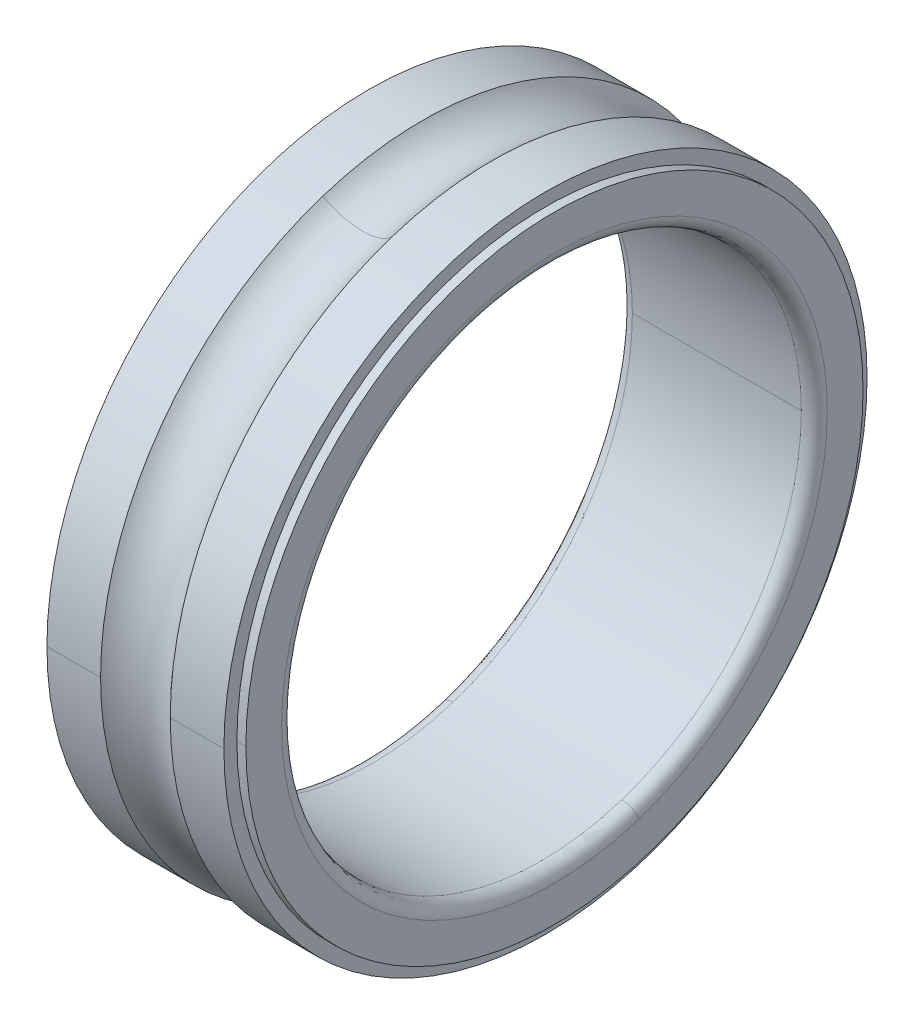
ISO-10303-21;
HEADER;
FILE_DESCRIPTION(('STEP AP214'),'2;1');
FILE_NAME('part.step','',(''),(''),'','','');
FILE_SCHEMA(('AUTOMOTIVE_DESIGN { 1 0 10303 214 1 1 1 1 }'));
ENDSEC;
DATA;
#1=APPLICATION_CONTEXT('core data for automotive mechanical design processes');
#2=APPLICATION_PROTOCOL_DEFINITION('international standard','automotive_design',2000,#1);
#3=PRODUCT_CONTEXT('',#1,'mechanical');
#4=PRODUCT('Part','Part','',(#3));
#5=PRODUCT_RELATED_PRODUCT_CATEGORY('part','',(#4));
#6=PRODUCT_DEFINITION_FORMATION('','',#4);
#7=PRODUCT_DEFINITION_CONTEXT('part definition',#1,'design');
#8=PRODUCT_DEFINITION('design','',#6,#7);
#9=PRODUCT_DEFINITION_SHAPE('','',#8);
#10=(LENGTH_UNIT() NAMED_UNIT(*) SI_UNIT(.MILLI.,.METRE.));
#11=(NAMED_UNIT(*) PLANE_ANGLE_UNIT() SI_UNIT($,.RADIAN.));
#12=(NAMED_UNIT(*) SI_UNIT($,.STERADIAN.) SOLID_ANGLE_UNIT());
#13=UNCERTAINTY_MEASURE_WITH_UNIT(LENGTH_MEASURE(1.E-05),#10,'distance_accuracy_value','');
#14=(GEOMETRIC_REPRESENTATION_CONTEXT(3) GLOBAL_UNCERTAINTY_ASSIGNED_CONTEXT((#13)) GLOBAL_UNIT_ASSIGNED_CONTEXT((#10,
#11,#12)) REPRESENTATION_CONTEXT('',''));
#15=CARTESIAN_POINT('',(0.,0.,0.));
#16=DIRECTION('',(0.,0.,1.));
#17=DIRECTION('',(1.,0.,0.));
#18=AXIS2_PLACEMENT_3D('',#15,#16,#17);
#19=CARTESIAN_POINT('',(0.,23.75,0.));
#20=DIRECTION('',(-1.,0.,0.));
#21=DIRECTION('',(0.,0.,1.));
#22=AXIS2_PLACEMENT_3D('',#19,#20,#21);
#23=PLANE('',#22);
#24=CARTESIAN_POINT('',(0.,0.,0.));
#25=DIRECTION('',(1.,0.,0.));
#26=DIRECTION('',(0.,0.,-1.));
#27=AXIS2_PLACEMENT_3D('',#24,#25,#26);
#28=CIRCLE('',#27,21.);
#29=CARTESIAN_POINT('',(0.,19.9721868421975,6.48935688187365));
#30=VERTEX_POINT('',#29);
#31=CARTESIAN_POINT('',(0.,-19.9721868421975,-6.48935688187364));
#32=VERTEX_POINT('',#31);
#33=EDGE_CURVE('E13',#30,#32,#28,.T.);
#34=ORIENTED_EDGE('',*,*,#33,.T.);
#35=CARTESIAN_POINT('',(0.,-19.9721868421982,-6.48935688187389));
#36=CARTESIAN_POINT('',(0.,-18.9527996449717,-9.6265513007404));
#37=CARTESIAN_POINT('',(0.,-17.3176794735263,-12.5637797669449));
#38=CARTESIAN_POINT('',(0.,-15.118107867562,-15.1390084363418));
#39=CARTESIAN_POINT('',(0.,-9.82778905209665,-19.2881146807117));
#40=CARTESIAN_POINT('',(0.,-3.36151600636661,-21.1293102340576));
#41=CARTESIAN_POINT('',(0.,0.0147797410590782,-21.3950362295894));
#42=CARTESIAN_POINT('',(0.,6.68945904005496,-20.5880379601854));
#43=CARTESIAN_POINT('',(0.,12.5637297063266,-17.3176352188327));
#44=CARTESIAN_POINT('',(0.,15.1390205227054,-15.1181215248857));
#45=CARTESIAN_POINT('',(0.,19.2881177141266,-9.82778309868488));
#46=CARTESIAN_POINT('',(0.,21.1292920808643,-3.36151425586648));
#47=CARTESIAN_POINT('',(0.,21.3951014572819,0.0147652534244056));
#48=CARTESIAN_POINT('',(0.,20.9914818887777,3.35213252144713));
#49=CARTESIAN_POINT('',(0.,19.9721868421982,6.48935688187389));
#50=B_SPLINE_CURVE_WITH_KNOTS('',5,(#35,#36,#37,#38,#39,#40,#41,#42,#43,#44,#45,#46,#47,#48,
#49),.UNSPECIFIED.,.F.,.F.,(6,3,3,3,6),(0.,0.785398163397448,1.5707963267949,2.35619449019234,
3.14159265358979),.UNSPECIFIED.);
#51=EDGE_CURVE('E33',#32,#30,#50,.T.);
#52=ORIENTED_EDGE('',*,*,#51,.T.);
#53=EDGE_LOOP('',(#34,#52));
#54=FACE_BOUND('',#53,.T.);
#55=CARTESIAN_POINT('',(0.,0.,0.));
#56=DIRECTION('',(1.,0.,0.));
#57=DIRECTION('',(0.,0.,-1.));
#58=AXIS2_PLACEMENT_3D('',#55,#56,#57);
#59=CIRCLE('',#58,23.75);
#60=CARTESIAN_POINT('',(0.,0.,23.75));
#61=VERTEX_POINT('',#60);
#62=CARTESIAN_POINT('',(0.,0.,-23.75));
#63=VERTEX_POINT('',#62);
#64=EDGE_CURVE('E407',#61,#63,#59,.T.);
#65=ORIENTED_EDGE('',*,*,#64,.F.);
#66=CARTESIAN_POINT('',(0.,0.,0.));
#67=DIRECTION('',(1.,0.,0.));
#68=DIRECTION('',(0.,0.,-1.));
#69=AXIS2_PLACEMENT_3D('',#66,#67,#68);
#70=CIRCLE('',#69,23.75);
#71=EDGE_CURVE('E402',#63,#61,#70,.T.);
#72=ORIENTED_EDGE('',*,*,#71,.F.);
#73=EDGE_LOOP('',(#65,#72));
#74=FACE_BOUND('',#73,.T.);
#75=ADVANCED_FACE('F24',(#54,#74),#23,.T.);
#76=CARTESIAN_POINT('',(15.,0.,0.));
#77=DIRECTION('',(1.,0.,0.));
#78=DIRECTION('',(0.,-1.,0.));
#79=AXIS2_PLACEMENT_3D('',#76,#77,#78);
#80=CYLINDRICAL_SURFACE('',#79,23.75);
#81=DIRECTION('',(1.,0.,0.));
#82=VECTOR('',#81,1.);
#83=CARTESIAN_POINT('',(0.,0.,23.75));
#84=LINE('',#83,#82);
#85=CARTESIAN_POINT('',(0.69,0.,23.75));
#86=VERTEX_POINT('',#85);
#87=EDGE_CURVE('E398',#61,#86,#84,.T.);
#88=ORIENTED_EDGE('',*,*,#87,.T.);
#89=CARTESIAN_POINT('',(0.69,0.,0.));
#90=DIRECTION('',(1.,0.,0.));
#91=DIRECTION('',(0.,0.,-1.));
#92=AXIS2_PLACEMENT_3D('',#89,#90,#91);
#93=CIRCLE('',#92,23.75);
#94=CARTESIAN_POINT('',(0.69,0.,-23.75));
#95=VERTEX_POINT('',#94);
#96=EDGE_CURVE('E393',#95,#86,#93,.T.);
#97=ORIENTED_EDGE('',*,*,#96,.F.);
#98=DIRECTION('',(1.,0.,0.));
#99=VECTOR('',#98,1.);
#100=CARTESIAN_POINT('',(0.,0.,-23.75));
#101=LINE('',#100,#99);
#102=EDGE_CURVE('E388',#63,#95,#101,.T.);
#103=ORIENTED_EDGE('',*,*,#102,.F.);
#104=ORIENTED_EDGE('',*,*,#71,.T.);
#105=EDGE_LOOP('',(#88,#97,#103,#104));
#106=FACE_BOUND('',#105,.T.);
#107=ADVANCED_FACE('F428',(#106),#80,.T.);
#108=CARTESIAN_POINT('',(15.,0.,0.));
#109=DIRECTION('',(1.,0.,0.));
#110=DIRECTION('',(0.,1.,0.));
#111=AXIS2_PLACEMENT_3D('',#108,#109,#110);
#112=CYLINDRICAL_SURFACE('',#111,23.75);
#113=ORIENTED_EDGE('',*,*,#87,.F.);
#114=ORIENTED_EDGE('',*,*,#64,.T.);
#115=ORIENTED_EDGE('',*,*,#102,.T.);
#116=CARTESIAN_POINT('',(0.69,0.,0.));
#117=DIRECTION('',(1.,0.,0.));
#118=DIRECTION('',(0.,0.,-1.));
#119=AXIS2_PLACEMENT_3D('',#116,#117,#118);
#120=CIRCLE('',#119,23.75);
#121=EDGE_CURVE('E383',#86,#95,#120,.T.);
#122=ORIENTED_EDGE('',*,*,#121,.F.);
#123=EDGE_LOOP('',(#113,#114,#115,#122));
#124=FACE_BOUND('',#123,.T.);
#125=ADVANCED_FACE('F423',(#124),#112,.T.);
#126=CARTESIAN_POINT('',(0.69,24.75,0.));
#127=DIRECTION('',(-1.,0.,0.));
#128=DIRECTION('',(0.,0.,1.));
#129=AXIS2_PLACEMENT_3D('',#126,#127,#128);
#130=PLANE('',#129);
#131=ORIENTED_EDGE('',*,*,#96,.T.);
#132=ORIENTED_EDGE('',*,*,#121,.T.);
#133=EDGE_LOOP('',(#131,#132));
#134=FACE_BOUND('',#133,.T.);
#135=CARTESIAN_POINT('',(0.69,0.,0.));
#136=DIRECTION('',(1.,0.,0.));
#137=DIRECTION('',(0.,0.,-1.));
#138=AXIS2_PLACEMENT_3D('',#135,#136,#137);
#139=CIRCLE('',#138,24.75);
#140=CARTESIAN_POINT('',(0.69,0.,24.75));
#141=VERTEX_POINT('',#140);
#142=CARTESIAN_POINT('',(0.69,0.,-24.75));
#143=VERTEX_POINT('',#142);
#144=EDGE_CURVE('E378',#141,#143,#139,.T.);
#145=ORIENTED_EDGE('',*,*,#144,.F.);
#146=CARTESIAN_POINT('',(0.69,0.,0.));
#147=DIRECTION('',(1.,0.,0.));
#148=DIRECTION('',(0.,0.,-1.));
#149=AXIS2_PLACEMENT_3D('',#146,#147,#148);
#150=CIRCLE('',#149,24.75);
#151=EDGE_CURVE('E373',#143,#141,#150,.T.);
#152=ORIENTED_EDGE('',*,*,#151,.F.);
#153=EDGE_LOOP('',(#145,#152));
#154=FACE_BOUND('',#153,.T.);
#155=ADVANCED_FACE('F430',(#134,#154),#130,.T.);
#156=CARTESIAN_POINT('',(15.,0.,0.));
#157=DIRECTION('',(1.,0.,0.));
#158=DIRECTION('',(0.,-1.,0.));
#159=AXIS2_PLACEMENT_3D('',#156,#157,#158);
#160=CYLINDRICAL_SURFACE('',#159,24.75);
#161=DIRECTION('',(1.,0.,0.));
#162=VECTOR('',#161,1.);
#163=CARTESIAN_POINT('',(0.69,0.,24.75));
#164=LINE('',#163,#162);
#165=CARTESIAN_POINT('',(4.8190486763091,0.,24.75));
#166=VERTEX_POINT('',#165);
#167=EDGE_CURVE('E369',#141,#166,#164,.T.);
#168=ORIENTED_EDGE('',*,*,#167,.T.);
#169=CARTESIAN_POINT('',(4.8190486763091,0.,0.));
#170=DIRECTION('',(1.,0.,0.));
#171=DIRECTION('',(0.,0.,-1.));
#172=AXIS2_PLACEMENT_3D('',#169,#170,#171);
#173=CIRCLE('',#172,24.75);
#174=CARTESIAN_POINT('',(4.81904867630903,23.538648778305,7.64817061077993));
#175=VERTEX_POINT('',#174);
#176=EDGE_CURVE('E364',#175,#166,#173,.T.);
#177=ORIENTED_EDGE('',*,*,#176,.F.);
#178=CARTESIAN_POINT('',(4.8190486763091,0.,0.));
#179=DIRECTION('',(1.,0.,0.));
#180=DIRECTION('',(0.,0.,-1.));
#181=AXIS2_PLACEMENT_3D('',#178,#179,#180);
#182=CIRCLE('',#181,24.75);
#183=CARTESIAN_POINT('',(4.8190486763091,0.,-24.75));
#184=VERTEX_POINT('',#183);
#185=EDGE_CURVE('E359',#184,#175,#182,.T.);
#186=ORIENTED_EDGE('',*,*,#185,.F.);
#187=DIRECTION('',(1.,0.,0.));
#188=VECTOR('',#187,1.);
#189=CARTESIAN_POINT('',(0.69,0.,-24.75));
#190=LINE('',#189,#188);
#191=EDGE_CURVE('E354',#143,#184,#190,.T.);
#192=ORIENTED_EDGE('',*,*,#191,.F.);
#193=ORIENTED_EDGE('',*,*,#151,.T.);
#194=EDGE_LOOP('',(#168,#177,#186,#192,#193));
#195=FACE_BOUND('',#194,.T.);
#196=ADVANCED_FACE('F433',(#195),#160,.T.);
#197=CARTESIAN_POINT('',(15.,0.,0.));
#198=DIRECTION('',(1.,0.,0.));
#199=DIRECTION('',(0.,1.,0.));
#200=AXIS2_PLACEMENT_3D('',#197,#198,#199);
#201=CYLINDRICAL_SURFACE('',#200,24.75);
#202=ORIENTED_EDGE('',*,*,#167,.F.);
#203=ORIENTED_EDGE('',*,*,#144,.T.);
#204=ORIENTED_EDGE('',*,*,#191,.T.);
#205=CARTESIAN_POINT('',(4.8190486763091,0.,0.));
#206=DIRECTION('',(1.,0.,0.));
#207=DIRECTION('',(0.,0.,-1.));
#208=AXIS2_PLACEMENT_3D('',#205,#206,#207);
#209=CIRCLE('',#208,24.75);
#210=CARTESIAN_POINT('',(4.81904867630903,-23.538648778305,-7.64817061077992));
#211=VERTEX_POINT('',#210);
#212=EDGE_CURVE('E349',#211,#184,#209,.T.);
#213=ORIENTED_EDGE('',*,*,#212,.F.);
#214=CARTESIAN_POINT('',(4.8190486763091,0.,0.));
#215=DIRECTION('',(1.,0.,0.));
#216=DIRECTION('',(0.,0.,-1.));
#217=AXIS2_PLACEMENT_3D('',#214,#215,#216);
#218=CIRCLE('',#217,24.75);
#219=EDGE_CURVE('E344',#166,#211,#218,.T.);
#220=ORIENTED_EDGE('',*,*,#219,.F.);
#221=EDGE_LOOP('',(#202,#203,#204,#213,#220));
#222=FACE_BOUND('',#221,.T.);
#223=ADVANCED_FACE('F439',(#222),#201,.T.);
#224=CARTESIAN_POINT('',(7.5,0.,0.));
#225=DIRECTION('',(1.,0.,0.));
#226=DIRECTION('',(0.,0.309016994374947,-0.951056516295154));
#227=AXIS2_PLACEMENT_3D('',#224,#225,#226);
#228=TOROIDAL_SURFACE('',#227,27.,3.5000000000001);
#229=CARTESIAN_POINT('',(7.5,-25.6785259399691,-8.34345884812357));
#230=DIRECTION('',(0.,0.309016994374947,-0.951056516295154));
#231=DIRECTION('',(-0.765986092483113,0.611393474761172,0.198653782098181));
#232=AXIS2_PLACEMENT_3D('',#229,#230,#231);
#233=CIRCLE('',#232,3.5000000000001);
#234=CARTESIAN_POINT('',(10.180951323691,-23.538648778305,-7.64817061077994));
#235=VERTEX_POINT('',#234);
#236=EDGE_CURVE('E340',#211,#235,#233,.T.);
#237=ORIENTED_EDGE('',*,*,#236,.T.);
#238=CARTESIAN_POINT('',(10.180951323691,0.,0.));
#239=DIRECTION('',(1.,0.,0.));
#240=DIRECTION('',(0.,0.,-1.));
#241=AXIS2_PLACEMENT_3D('',#238,#239,#240);
#242=CIRCLE('',#241,24.75);
#243=CARTESIAN_POINT('',(10.180951323691,0.,24.75));
#244=VERTEX_POINT('',#243);
#245=EDGE_CURVE('E335',#244,#235,#242,.T.);
#246=ORIENTED_EDGE('',*,*,#245,.F.);
#247=CARTESIAN_POINT('',(10.180951323691,0.,0.));
#248=DIRECTION('',(1.,0.,0.));
#249=DIRECTION('',(0.,0.,-1.));
#250=AXIS2_PLACEMENT_3D('',#247,#248,#249);
#251=CIRCLE('',#250,24.75);
#252=CARTESIAN_POINT('',(10.180951323691,23.538648778305,7.64817061077994));
#253=VERTEX_POINT('',#252);
#254=EDGE_CURVE('E330',#253,#244,#251,.T.);
#255=ORIENTED_EDGE('',*,*,#254,.F.);
#256=CARTESIAN_POINT('',(7.5,25.6785259399691,8.34345884812358));
#257=DIRECTION('',(0.,-0.309016994374947,0.951056516295154));
#258=DIRECTION('',(-0.765986092483114,-0.611393474761171,-0.198653782098181));
#259=AXIS2_PLACEMENT_3D('',#256,#257,#258);
#260=CIRCLE('',#259,3.5000000000001);
#261=EDGE_CURVE('E325',#175,#253,#260,.T.);
#262=ORIENTED_EDGE('',*,*,#261,.F.);
#263=ORIENTED_EDGE('',*,*,#176,.T.);
#264=ORIENTED_EDGE('',*,*,#219,.T.);
#265=EDGE_LOOP('',(#237,#246,#255,#262,#263,#264));
#266=FACE_BOUND('',#265,.T.);
#267=ADVANCED_FACE('F446',(#266),#228,.F.);
#268=CARTESIAN_POINT('',(7.5,0.,0.));
#269=DIRECTION('',(1.,0.,0.));
#270=DIRECTION('',(0.,-0.309016994374947,0.951056516295154));
#271=AXIS2_PLACEMENT_3D('',#268,#269,#270);
#272=TOROIDAL_SURFACE('',#271,27.,3.5000000000001);
#273=ORIENTED_EDGE('',*,*,#236,.F.);
#274=ORIENTED_EDGE('',*,*,#212,.T.);
#275=ORIENTED_EDGE('',*,*,#185,.T.);
#276=ORIENTED_EDGE('',*,*,#261,.T.);
#277=CARTESIAN_POINT('',(10.180951323691,0.,0.));
#278=DIRECTION('',(1.,0.,0.));
#279=DIRECTION('',(0.,0.,-1.));
#280=AXIS2_PLACEMENT_3D('',#277,#278,#279);
#281=CIRCLE('',#280,24.75);
#282=CARTESIAN_POINT('',(10.180951323691,0.,-24.75));
#283=VERTEX_POINT('',#282);
#284=EDGE_CURVE('E320',#283,#253,#281,.T.);
#285=ORIENTED_EDGE('',*,*,#284,.F.);
#286=CARTESIAN_POINT('',(10.180951323691,0.,0.));
#287=DIRECTION('',(1.,0.,0.));
#288=DIRECTION('',(0.,0.,-1.));
#289=AXIS2_PLACEMENT_3D('',#286,#287,#288);
#290=CIRCLE('',#289,24.75);
#291=EDGE_CURVE('E315',#235,#283,#290,.T.);
#292=ORIENTED_EDGE('',*,*,#291,.F.);
#293=EDGE_LOOP('',(#273,#274,#275,#276,#285,#292));
#294=FACE_BOUND('',#293,.T.);
#295=ADVANCED_FACE('F443',(#294),#272,.F.);
#296=CARTESIAN_POINT('',(15.,0.,0.));
#297=DIRECTION('',(1.,0.,0.));
#298=DIRECTION('',(0.,1.,0.));
#299=AXIS2_PLACEMENT_3D('',#296,#297,#298);
#300=CYLINDRICAL_SURFACE('',#299,24.75);
#301=DIRECTION('',(1.,0.,0.));
#302=VECTOR('',#301,1.);
#303=CARTESIAN_POINT('',(10.180951323691,0.,24.75));
#304=LINE('',#303,#302);
#305=CARTESIAN_POINT('',(14.31,0.,24.75));
#306=VERTEX_POINT('',#305);
#307=EDGE_CURVE('E310',#244,#306,#304,.T.);
#308=ORIENTED_EDGE('',*,*,#307,.F.);
#309=ORIENTED_EDGE('',*,*,#245,.T.);
#310=ORIENTED_EDGE('',*,*,#291,.T.);
#311=DIRECTION('',(1.,0.,0.));
#312=VECTOR('',#311,1.);
#313=CARTESIAN_POINT('',(10.180951323691,0.,-24.75));
#314=LINE('',#313,#312);
#315=CARTESIAN_POINT('',(14.31,0.,-24.75));
#316=VERTEX_POINT('',#315);
#317=EDGE_CURVE('E306',#283,#316,#314,.T.);
#318=ORIENTED_EDGE('',*,*,#317,.T.);
#319=CARTESIAN_POINT('',(14.31,0.,0.));
#320=DIRECTION('',(1.,0.,0.));
#321=DIRECTION('',(0.,0.,-1.));
#322=AXIS2_PLACEMENT_3D('',#319,#320,#321);
#323=CIRCLE('',#322,24.75);
#324=EDGE_CURVE('E301',#306,#316,#323,.T.);
#325=ORIENTED_EDGE('',*,*,#324,.F.);
#326=EDGE_LOOP('',(#308,#309,#310,#318,#325));
#327=FACE_BOUND('',#326,.T.);
#328=ADVANCED_FACE('F452',(#327),#300,.T.);
#329=CARTESIAN_POINT('',(14.31,23.75,0.));
#330=DIRECTION('',(1.,0.,0.));
#331=DIRECTION('',(0.,0.,-1.));
#332=AXIS2_PLACEMENT_3D('',#329,#330,#331);
#333=PLANE('',#332);
#334=CARTESIAN_POINT('',(14.31,0.,0.));
#335=DIRECTION('',(1.,0.,0.));
#336=DIRECTION('',(0.,0.,-1.));
#337=AXIS2_PLACEMENT_3D('',#334,#335,#336);
#338=CIRCLE('',#337,24.75);
#339=EDGE_CURVE('E296',#316,#306,#338,.T.);
#340=ORIENTED_EDGE('',*,*,#339,.T.);
#341=ORIENTED_EDGE('',*,*,#324,.T.);
#342=EDGE_LOOP('',(#340,#341));
#343=FACE_BOUND('',#342,.T.);
#344=CARTESIAN_POINT('',(14.31,0.,0.));
#345=DIRECTION('',(1.,0.,0.));
#346=DIRECTION('',(0.,0.,-1.));
#347=AXIS2_PLACEMENT_3D('',#344,#345,#346);
#348=CIRCLE('',#347,23.75);
#349=CARTESIAN_POINT('',(14.31,0.,23.75));
#350=VERTEX_POINT('',#349);
#351=CARTESIAN_POINT('',(14.31,0.,-23.75));
#352=VERTEX_POINT('',#351);
#353=EDGE_CURVE('E291',#350,#352,#348,.T.);
#354=ORIENTED_EDGE('',*,*,#353,.F.);
#355=CARTESIAN_POINT('',(14.31,0.,0.));
#356=DIRECTION('',(1.,0.,0.));
#357=DIRECTION('',(0.,0.,-1.));
#358=AXIS2_PLACEMENT_3D('',#355,#356,#357);
#359=CIRCLE('',#358,23.75);
#360=EDGE_CURVE('E286',#352,#350,#359,.T.);
#361=ORIENTED_EDGE('',*,*,#360,.F.);
#362=EDGE_LOOP('',(#354,#361));
#363=FACE_BOUND('',#362,.T.);
#364=ADVANCED_FACE('F456',(#343,#363),#333,.T.);
#365=CARTESIAN_POINT('',(15.,0.,0.));
#366=DIRECTION('',(1.,0.,0.));
#367=DIRECTION('',(0.,-1.,0.));
#368=AXIS2_PLACEMENT_3D('',#365,#366,#367);
#369=CYLINDRICAL_SURFACE('',#368,23.75);
#370=DIRECTION('',(1.,0.,0.));
#371=VECTOR('',#370,1.);
#372=CARTESIAN_POINT('',(14.31,0.,23.75));
#373=LINE('',#372,#371);
#374=CARTESIAN_POINT('',(15.,0.,23.75));
#375=VERTEX_POINT('',#374);
#376=EDGE_CURVE('E282',#350,#375,#373,.T.);
#377=ORIENTED_EDGE('',*,*,#376,.T.);
#378=CARTESIAN_POINT('',(15.,0.,0.));
#379=DIRECTION('',(1.,0.,0.));
#380=DIRECTION('',(0.,0.,-1.));
#381=AXIS2_PLACEMENT_3D('',#378,#379,#380);
#382=CIRCLE('',#381,23.75);
#383=CARTESIAN_POINT('',(15.,0.,-23.75));
#384=VERTEX_POINT('',#383);
#385=EDGE_CURVE('E277',#384,#375,#382,.T.);
#386=ORIENTED_EDGE('',*,*,#385,.F.);
#387=DIRECTION('',(1.,0.,0.));
#388=VECTOR('',#387,1.);
#389=CARTESIAN_POINT('',(14.31,0.,-23.75));
#390=LINE('',#389,#388);
#391=EDGE_CURVE('E272',#352,#384,#390,.T.);
#392=ORIENTED_EDGE('',*,*,#391,.F.);
#393=ORIENTED_EDGE('',*,*,#360,.T.);
#394=EDGE_LOOP('',(#377,#386,#392,#393));
#395=FACE_BOUND('',#394,.T.);
#396=ADVANCED_FACE('F459',(#395),#369,.T.);
#397=CARTESIAN_POINT('',(15.,0.,0.));
#398=DIRECTION('',(1.,0.,0.));
#399=DIRECTION('',(0.,1.,0.));
#400=AXIS2_PLACEMENT_3D('',#397,#398,#399);
#401=CYLINDRICAL_SURFACE('',#400,23.75);
#402=ORIENTED_EDGE('',*,*,#376,.F.);
#403=ORIENTED_EDGE('',*,*,#353,.T.);
#404=ORIENTED_EDGE('',*,*,#391,.T.);
#405=CARTESIAN_POINT('',(15.,0.,0.));
#406=DIRECTION('',(1.,0.,0.));
#407=DIRECTION('',(0.,0.,-1.));
#408=AXIS2_PLACEMENT_3D('',#405,#406,#407);
#409=CIRCLE('',#408,23.75);
#410=EDGE_CURVE('E269',#375,#384,#409,.T.);
#411=ORIENTED_EDGE('',*,*,#410,.F.);
#412=EDGE_LOOP('',(#402,#403,#404,#411));
#413=FACE_BOUND('',#412,.T.);
#414=ADVANCED_FACE('F465',(#413),#401,.T.);
#415=CARTESIAN_POINT('',(15.,21.,0.));
#416=DIRECTION('',(1.,0.,0.));
#417=DIRECTION('',(0.,0.,-1.));
#418=AXIS2_PLACEMENT_3D('',#415,#416,#417);
#419=PLANE('',#418);
#420=ORIENTED_EDGE('',*,*,#385,.T.);
#421=ORIENTED_EDGE('',*,*,#410,.T.);
#422=EDGE_LOOP('',(#420,#421));
#423=FACE_BOUND('',#422,.T.);
#424=CARTESIAN_POINT('',(15.,-19.9721868421967,-6.48935688187345));
#425=CARTESIAN_POINT('',(15.,-19.8660118134118,-6.81615360728426));
#426=CARTESIAN_POINT('',(15.,-19.7518026238298,-7.14033922348104));
#427=CARTESIAN_POINT('',(15.,-19.5076210129556,-7.7827186302954));
#428=CARTESIAN_POINT('',(15.,-19.3776485916635,-8.10091242091297));
#429=CARTESIAN_POINT('',(15.,-19.1022456072533,-8.73053856941777));
#430=CARTESIAN_POINT('',(15.,-18.9568150441353,-9.04197092730499));
#431=CARTESIAN_POINT('',(15.,-18.6508482813472,-9.65732475988335));
#432=CARTESIAN_POINT('',(15.,-18.4903120816771,-9.9612462345745));
#433=CARTESIAN_POINT('',(15.,-18.1545202153776,-10.5608459082961));
#434=CARTESIAN_POINT('',(15.,-17.9792645487483,-10.8565241073266));
#435=CARTESIAN_POINT('',(15.,-17.6144561091669,-11.4389249737312));
#436=CARTESIAN_POINT('',(15.,-17.424903336215,-11.7256476411052));
#437=CARTESIAN_POINT('',(15.,-17.031957291854,-12.2894466884528));
#438=CARTESIAN_POINT('',(15.,-16.828564020445,-12.5665230684264));
#439=CARTESIAN_POINT('',(15.,-16.4084269824602,-13.110362043918));
#440=CARTESIAN_POINT('',(15.,-16.1916832158845,-13.3771246394361));
#441=CARTESIAN_POINT('',(15.,-15.7453673393144,-13.8996933904296));
#442=CARTESIAN_POINT('',(15.,-15.5157952293201,-14.155499545905));
#443=CARTESIAN_POINT('',(15.,-15.0443757260298,-14.655539157681));
#444=CARTESIAN_POINT('',(15.,-14.8025283327338,-14.8997726139817));
#445=CARTESIAN_POINT('',(15.,-14.3071408941807,-15.3760784475387));
#446=CARTESIAN_POINT('',(15.,-14.0536008489237,-15.608150824795));
#447=CARTESIAN_POINT('',(15.,-13.535438906682,-16.0595754176012));
#448=CARTESIAN_POINT('',(15.,-13.2708170096975,-16.278927633151));
#449=CARTESIAN_POINT('',(15.,-12.7311288613136,-16.7043834638379));
#450=CARTESIAN_POINT('',(15.,-12.4560626099143,-16.9104870789751));
#451=CARTESIAN_POINT('',(15.,-11.8961484113975,-17.308949187177));
#452=CARTESIAN_POINT('',(15.,-11.61130046428,-17.5013076802417));
#453=CARTESIAN_POINT('',(15.,-11.0325090979803,-17.8718161358398));
#454=CARTESIAN_POINT('',(15.,-10.738565678798,-18.0499660983732));
#455=CARTESIAN_POINT('',(15.,-10.142291503812,-18.391628314045));
#456=CARTESIAN_POINT('',(15.,-9.83996074800828,-18.5551405671834));
#457=CARTESIAN_POINT('',(15.,-9.22764024105125,-18.8671334487253));
#458=CARTESIAN_POINT('',(15.,-8.91765048989791,-19.0156140771289));
#459=CARTESIAN_POINT('',(15.,-8.290758784704,-19.297186006362));
#460=CARTESIAN_POINT('',(15.,-7.97385683066344,-19.4302773071915));
#461=CARTESIAN_POINT('',(15.,-7.3339041642597,-19.6807499526754));
#462=CARTESIAN_POINT('',(15.,-7.01085345189653,-19.7981312973298));
#463=CARTESIAN_POINT('',(15.,-6.35938152630957,-20.0169012485227));
#464=CARTESIAN_POINT('',(15.,-6.03096031308577,-20.1182898550613));
#465=CARTESIAN_POINT('',(15.,-5.36953858124651,-20.3048300759889));
#466=CARTESIAN_POINT('',(15.,-5.03653806263105,-20.3899816903779));
#467=CARTESIAN_POINT('',(15.,-4.3667599474252,-20.5438427893089));
#468=CARTESIAN_POINT('',(15.,-4.02998235083482,-20.612552273851));
#469=CARTESIAN_POINT('',(15.,-3.35346140640755,-20.7333635859214));
#470=CARTESIAN_POINT('',(15.,-3.01371805857066,-20.7854654134499));
#471=CARTESIAN_POINT('',(15.,-2.33208408313332,-20.8729358936273));
#472=CARTESIAN_POINT('',(15.,-1.99019345553287,-20.9083045462762));
#473=CARTESIAN_POINT('',(15.,-1.30508856503638,-20.9622234705121));
#474=CARTESIAN_POINT('',(15.,-0.961874302140345,-20.9807737420992));
#475=CARTESIAN_POINT('',(15.,-0.274948974274021,-21.0010112149826));
#476=CARTESIAN_POINT('',(15.,0.0687620906962641,-21.0026984162788));
#477=CARTESIAN_POINT('',(15.,0.755852992650046,-20.9892056839648));
#478=CARTESIAN_POINT('',(15.,1.09923282963354,-20.9740257503545));
#479=CARTESIAN_POINT('',(15.,1.78483404350992,-20.9268353180171));
#480=CARTESIAN_POINT('',(15.,2.12705542040281,-20.8948248192899));
#481=CARTESIAN_POINT('',(15.,2.80951527282598,-20.8140503728139));
#482=CARTESIAN_POINT('',(15.,3.14975374835627,-20.7652864250651));
#483=CARTESIAN_POINT('',(15.,3.82742813376533,-20.6511225571672));
#484=CARTESIAN_POINT('',(15.,4.1648640436441,-20.5857226370181));
#485=CARTESIAN_POINT('',(15.,4.83612038508733,-20.4384443784555));
#486=CARTESIAN_POINT('',(15.,5.16994081665179,-20.3565660400421));
#487=CARTESIAN_POINT('',(15.,5.83316199880753,-20.1765281970399));
#488=CARTESIAN_POINT('',(15.,6.16256274939882,-20.0783686924511));
#489=CARTESIAN_POINT('',(15.,6.81615101434796,-19.8660049919424));
#490=CARTESIAN_POINT('',(15.,7.14033852870581,-19.7518007960226));
#491=CARTESIAN_POINT('',(15.,7.78271932507051,-19.5076228407628));
#492=CARTESIAN_POINT('',(15.,8.10091260707737,-19.377649081423));
#493=CARTESIAN_POINT('',(15.,8.73053838325327,-19.1022451174939));
#494=CARTESIAN_POINT('',(15.,9.04197087742232,-18.9568149129047));
#495=CARTESIAN_POINT('',(15.,9.65732480976592,-18.6508484125779));
#496=CARTESIAN_POINT('',(15.,9.96124624794046,-18.4903121168403));
#497=CARTESIAN_POINT('',(15.,10.5608458949301,-18.1545201802145));
#498=CARTESIAN_POINT('',(15.,10.8565241037452,-17.9792645393264));
#499=CARTESIAN_POINT('',(15.,11.4389249773125,-17.6144561185889));
#500=CARTESIAN_POINT('',(15.,11.7256476420648,-17.4249033387396));
#501=CARTESIAN_POINT('',(15.,12.2894466874931,-17.0319572893294));
#502=CARTESIAN_POINT('',(15.,12.5665230681692,-16.8285640197686));
#503=CARTESIAN_POINT('',(15.,13.1103620441751,-16.4084269831367));
#504=CARTESIAN_POINT('',(15.,13.377124639505,-16.1916832160658));
#505=CARTESIAN_POINT('',(15.,13.8996933903607,-15.7453673391332));
#506=CARTESIAN_POINT('',(15.,14.1554995458865,-15.5157952292716));
#507=CARTESIAN_POINT('',(15.,14.6555391576994,-15.0443757260784));
#508=CARTESIAN_POINT('',(15.,14.8997726139866,-14.8025283327469));
#509=CARTESIAN_POINT('',(15.,15.3760784475337,-14.3071408941678));
#510=CARTESIAN_POINT('',(15.,15.6081508247937,-14.0536008489202));
#511=CARTESIAN_POINT('',(15.,16.0595754176025,-13.5354389066856));
#512=CARTESIAN_POINT('',(15.,16.2789276331513,-13.2708170096985));
#513=CARTESIAN_POINT('',(15.,16.7043834638375,-12.7311288613127));
#514=CARTESIAN_POINT('',(15.,16.9104870789749,-12.4560626099141));
#515=CARTESIAN_POINT('',(15.,17.308949187177,-11.8961484113978));
#516=CARTESIAN_POINT('',(15.,17.5013076802417,-11.6113004642802));
#517=CARTESIAN_POINT('',(15.,17.8718161358397,-11.0325090979803));
#518=CARTESIAN_POINT('',(15.,18.0499660983731,-10.738565678798));
#519=CARTESIAN_POINT('',(15.,18.391628314045,-10.142291503812));
#520=CARTESIAN_POINT('',(15.,18.5551405671834,-9.83996074800835));
#521=CARTESIAN_POINT('',(15.,18.8671334487253,-9.22764024105131));
#522=CARTESIAN_POINT('',(15.,19.0156140771288,-8.91765048989797));
#523=CARTESIAN_POINT('',(15.,19.297186006362,-8.29075878470405));
#524=CARTESIAN_POINT('',(15.,19.4302773071915,-7.97385683066348));
#525=CARTESIAN_POINT('',(15.,19.6807499526753,-7.33390416425978));
#526=CARTESIAN_POINT('',(15.,19.7981312973295,-7.01085345189665));
#527=CARTESIAN_POINT('',(15.,20.016901248523,-6.35938152630955));
#528=CARTESIAN_POINT('',(15.,20.1182898550623,-6.03096031308556));
#529=CARTESIAN_POINT('',(15.,20.3048300759879,-5.36953858124683));
#530=CARTESIAN_POINT('',(15.,20.3899816903743,-5.03653806263208));
#531=CARTESIAN_POINT('',(15.,20.5438427893125,-4.36675994742428));
#532=CARTESIAN_POINT('',(15.,20.6125522738644,-4.02998235083122));
#533=CARTESIAN_POINT('',(15.,20.733363585908,-3.35346140641125));
#534=CARTESIAN_POINT('',(15.,20.7854654133998,-3.01371805858433));
#535=CARTESIAN_POINT('',(15.,20.8729358936774,-2.33208408311977));
#536=CARTESIAN_POINT('',(15.,20.9083045464633,-1.99019345548213));
#537=CARTESIAN_POINT('',(15.,20.962223470325,-1.30508856508725));
#538=CARTESIAN_POINT('',(15.,20.9807737414008,-0.961874302330007));
#539=CARTESIAN_POINT('',(15.,21.001011215681,-0.274948974084504));
#540=CARTESIAN_POINT('',(15.,21.0026984188853,0.0687620914037546));
#541=CARTESIAN_POINT('',(15.,20.9892056813583,0.755852991942415));
#542=CARTESIAN_POINT('',(15.,20.9740257406269,1.09923282699282));
#543=CARTESIAN_POINT('',(15.,20.9268353277447,1.78483404615051));
#544=CARTESIAN_POINT('',(15.,20.8948248555938,2.1270554302578));
#545=CARTESIAN_POINT('',(15.,20.81405033651,2.80951526297088));
#546=CARTESIAN_POINT('',(15.,20.765286289577,3.14975371157666));
#547=CARTESIAN_POINT('',(15.,20.6511226926553,3.82742817054484));
#548=CARTESIAN_POINT('',(15.,20.5857231426665,4.16486418090724));
#549=CARTESIAN_POINT('',(15.,20.4384438728071,4.83612024782408));
#550=CARTESIAN_POINT('',(15.,20.3565641529364,5.16994030437853));
#551=CARTESIAN_POINT('',(15.,20.1765300841456,5.83316251108068));
#552=CARTESIAN_POINT('',(15.,20.0783757352255,6.16256466122839));
#553=CARTESIAN_POINT('',(15.,19.9721868421968,6.48935688187334));
#554=B_SPLINE_CURVE_WITH_KNOTS('',3,(#424,#425,#426,#427,#428,#429,#430,#431,#432,#433,#434,
#435,#436,#437,#438,#439,#440,#441,#442,#443,#444,#445,#446,#447,#448,#449,#450,#451,#452,#453,
#454,#455,#456,#457,#458,#459,#460,#461,#462,#463,#464,#465,#466,#467,#468,#469,#470,#471,#472,
#473,#474,#475,#476,#477,#478,#479,#480,#481,#482,#483,#484,#485,#486,#487,#488,#489,#490,#491,
#492,#493,#494,#495,#496,#497,#498,#499,#500,#501,#502,#503,#504,#505,#506,#507,#508,#509,#510,
#511,#512,#513,#514,#515,#516,#517,#518,#519,#520,#521,#522,#523,#524,#525,#526,#527,#528,#529,
#530,#531,#532,#533,#534,#535,#536,#537,#538,#539,#540,#541,#542,#543,#544,#545,#546,#547,#548,
#549,#550,#551,#552,#553),.UNSPECIFIED.,.F.,.F.,(4,2,2,2,2,2,2,2,2,2,2,2,2,2,2,2,2,2,2,2,2,2,2,
2,2,2,2,2,2,2,2,2,2,2,2,2,2,2,2,2,2,2,2,2,2,2,2,2,2,2,2,2,2,2,2,2,2,2,2,2,2,2,2,2,4),(0.,
1.03073159796224,2.06146319592448,3.09219479388672,4.12292639184895,5.15365798981119,
6.18438958777343,7.21512118573566,8.24585278369791,9.27658438166014,10.3073159796224,
11.3380475775846,12.3687791755469,13.3995107735091,14.4302423714713,15.4609739694336,
16.4917055673958,17.5224371653581,18.5531687633203,19.5839003612825,20.6146319592448,
21.645363557207,22.6760951551692,23.7068267531315,24.7375583510937,25.768289949056,
26.7990215470182,27.8297531449804,28.8604847429427,29.8912163409049,30.9219479388671,
31.9526795368294,32.9834111347916,34.0141427327539,35.0448743307161,36.0756059286783,
37.1063375266406,38.1370691246028,39.1678007225651,40.1985323205273,41.2292639184895,
42.2599955164518,43.290727114414,44.3214587123762,45.3521903103385,46.3829219083007,
47.4136535062629,48.4443851042252,49.4751167021874,50.5058483001497,51.5365798981119,
52.5673114960741,53.5980430940364,54.6287746919986,55.6595062899608,56.6902378879231,
57.7209694858853,58.7517010838475,59.7824326818098,60.813164279772,61.8438958777343,
62.8746274756965,63.9053590736588,64.936090671621,65.9668222695832),.UNSPECIFIED.);
#555=CARTESIAN_POINT('',(15.,-19.9721868421968,-6.48935688187341));
#556=VERTEX_POINT('',#555);
#557=CARTESIAN_POINT('',(15.,19.9721868421968,6.48935688187342));
#558=VERTEX_POINT('',#557);
#559=EDGE_CURVE('E268',#556,#558,#554,.T.);
#560=ORIENTED_EDGE('',*,*,#559,.F.);
#561=CARTESIAN_POINT('',(15.,19.9721868421967,6.48935688187345));
#562=CARTESIAN_POINT('',(15.,19.8660118134118,6.81615360728426));
#563=CARTESIAN_POINT('',(15.,19.7518026238298,7.14033922348104));
#564=CARTESIAN_POINT('',(15.,19.5076210129556,7.7827186302954));
#565=CARTESIAN_POINT('',(15.,19.3776485916635,8.10091242091297));
#566=CARTESIAN_POINT('',(15.,19.1022456072533,8.73053856941777));
#567=CARTESIAN_POINT('',(15.,18.9568150441353,9.04197092730499));
#568=CARTESIAN_POINT('',(15.,18.6508482813472,9.65732475988336));
#569=CARTESIAN_POINT('',(15.,18.4903120816771,9.9612462345745));
#570=CARTESIAN_POINT('',(15.,18.1545202153776,10.5608459082961));
#571=CARTESIAN_POINT('',(15.,17.9792645487483,10.8565241073266));
#572=CARTESIAN_POINT('',(15.,17.6144561091669,11.4389249737312));
#573=CARTESIAN_POINT('',(15.,17.424903336215,11.7256476411052));
#574=CARTESIAN_POINT('',(15.,17.031957291854,12.2894466884528));
#575=CARTESIAN_POINT('',(15.,16.828564020445,12.5665230684264));
#576=CARTESIAN_POINT('',(15.,16.4084269824602,13.1103620439181));
#577=CARTESIAN_POINT('',(15.,16.1916832158845,13.3771246394361));
#578=CARTESIAN_POINT('',(15.,15.7453673393144,13.8996933904296));
#579=CARTESIAN_POINT('',(15.,15.5157952293201,14.155499545905));
#580=CARTESIAN_POINT('',(15.,15.0443757260298,14.655539157681));
#581=CARTESIAN_POINT('',(15.,14.8025283327338,14.8997726139817));
#582=CARTESIAN_POINT('',(15.,14.3071408941807,15.3760784475387));
#583=CARTESIAN_POINT('',(15.,14.0536008489236,15.608150824795));
#584=CARTESIAN_POINT('',(15.,13.535438906682,16.0595754176012));
#585=CARTESIAN_POINT('',(15.,13.2708170096975,16.278927633151));
#586=CARTESIAN_POINT('',(15.,12.7311288613136,16.7043834638379));
#587=CARTESIAN_POINT('',(15.,12.4560626099143,16.9104870789751));
#588=CARTESIAN_POINT('',(15.,11.8961484113975,17.308949187177));
#589=CARTESIAN_POINT('',(15.,11.61130046428,17.5013076802417));
#590=CARTESIAN_POINT('',(15.,11.0325090979803,17.8718161358398));
#591=CARTESIAN_POINT('',(15.,10.738565678798,18.0499660983732));
#592=CARTESIAN_POINT('',(15.,10.142291503812,18.391628314045));
#593=CARTESIAN_POINT('',(15.,9.83996074800827,18.5551405671834));
#594=CARTESIAN_POINT('',(15.,9.22764024105125,18.8671334487253));
#595=CARTESIAN_POINT('',(15.,8.9176504898979,19.0156140771289));
#596=CARTESIAN_POINT('',(15.,8.29075878470399,19.297186006362));
#597=CARTESIAN_POINT('',(15.,7.97385683066342,19.4302773071915));
#598=CARTESIAN_POINT('',(15.,7.33390416425969,19.6807499526754));
#599=CARTESIAN_POINT('',(15.,7.01085345189651,19.7981312973298));
#600=CARTESIAN_POINT('',(15.,6.35938152630955,20.0169012485227));
#601=CARTESIAN_POINT('',(15.,6.03096031308575,20.1182898550613));
#602=CARTESIAN_POINT('',(15.,5.36953858124649,20.3048300759889));
#603=CARTESIAN_POINT('',(15.,5.03653806263103,20.3899816903779));
#604=CARTESIAN_POINT('',(15.,4.36675994742517,20.543842789309));
#605=CARTESIAN_POINT('',(15.,4.02998235083478,20.612552273851));
#606=CARTESIAN_POINT('',(15.,3.35346140640751,20.7333635859215));
#607=CARTESIAN_POINT('',(15.,3.01371805857062,20.7854654134499));
#608=CARTESIAN_POINT('',(15.,2.33208408313329,20.8729358936273));
#609=CARTESIAN_POINT('',(15.,1.99019345553284,20.9083045462762));
#610=CARTESIAN_POINT('',(15.,1.30508856503636,20.9622234705121));
#611=CARTESIAN_POINT('',(15.,0.961874302140322,20.9807737420992));
#612=CARTESIAN_POINT('',(15.,0.274948974273998,21.0010112149826));
#613=CARTESIAN_POINT('',(15.,-0.0687620906962899,21.0026984162788));
#614=CARTESIAN_POINT('',(15.,-0.755852992650073,20.9892056839648));
#615=CARTESIAN_POINT('',(15.,-1.09923282963357,20.9740257503545));
#616=CARTESIAN_POINT('',(15.,-1.78483404350995,20.9268353180171));
#617=CARTESIAN_POINT('',(15.,-2.12705542040283,20.8948248192899));
#618=CARTESIAN_POINT('',(15.,-2.80951527282601,20.8140503728139));
#619=CARTESIAN_POINT('',(15.,-3.1497537483563,20.7652864250651));
#620=CARTESIAN_POINT('',(15.,-3.82742813376536,20.6511225571672));
#621=CARTESIAN_POINT('',(15.,-4.16486404364413,20.5857226370181));
#622=CARTESIAN_POINT('',(15.,-4.83612038508736,20.4384443784555));
#623=CARTESIAN_POINT('',(15.,-5.16994081665182,20.3565660400421));
#624=CARTESIAN_POINT('',(15.,-5.83316199880757,20.1765281970399));
#625=CARTESIAN_POINT('',(15.,-6.16256274939886,20.0783686924511));
#626=CARTESIAN_POINT('',(15.,-6.816151014348,19.8660049919424));
#627=CARTESIAN_POINT('',(15.,-7.14033852870585,19.7518007960226));
#628=CARTESIAN_POINT('',(15.,-7.78271932507055,19.5076228407628));
#629=CARTESIAN_POINT('',(15.,-8.1009126070774,19.377649081423));
#630=CARTESIAN_POINT('',(15.,-8.7305383832533,19.1022451174939));
#631=CARTESIAN_POINT('',(15.,-9.04197087742235,18.9568149129047));
#632=CARTESIAN_POINT('',(15.,-9.65732480976594,18.6508484125778));
#633=CARTESIAN_POINT('',(15.,-9.96124624794048,18.4903121168403));
#634=CARTESIAN_POINT('',(15.,-10.5608458949301,18.1545201802145));
#635=CARTESIAN_POINT('',(15.,-10.8565241037452,17.9792645393263));
#636=CARTESIAN_POINT('',(15.,-11.4389249773125,17.6144561185889));
#637=CARTESIAN_POINT('',(15.,-11.7256476420648,17.4249033387396));
#638=CARTESIAN_POINT('',(15.,-12.2894466874931,17.0319572893294));
#639=CARTESIAN_POINT('',(15.,-12.5665230681692,16.8285640197686));
#640=CARTESIAN_POINT('',(15.,-13.1103620441752,16.4084269831367));
#641=CARTESIAN_POINT('',(15.,-13.377124639505,16.1916832160658));
#642=CARTESIAN_POINT('',(15.,-13.8996933903607,15.7453673391332));
#643=CARTESIAN_POINT('',(15.,-14.1554995458865,15.5157952292715));
#644=CARTESIAN_POINT('',(15.,-14.6555391576995,15.0443757260784));
#645=CARTESIAN_POINT('',(15.,-14.8997726139866,14.8025283327468));
#646=CARTESIAN_POINT('',(15.,-15.3760784475337,14.3071408941677));
#647=CARTESIAN_POINT('',(15.,-15.6081508247937,14.0536008489202));
#648=CARTESIAN_POINT('',(15.,-16.0595754176025,13.5354389066855));
#649=CARTESIAN_POINT('',(15.,-16.2789276331513,13.2708170096984));
#650=CARTESIAN_POINT('',(15.,-16.7043834638375,12.7311288613127));
#651=CARTESIAN_POINT('',(15.,-16.910487078975,12.456062609914));
#652=CARTESIAN_POINT('',(15.,-17.308949187177,11.8961484113978));
#653=CARTESIAN_POINT('',(15.,-17.5013076802417,11.6113004642801));
#654=CARTESIAN_POINT('',(15.,-17.8718161358397,11.0325090979802));
#655=CARTESIAN_POINT('',(15.,-18.0499660983732,10.738565678798));
#656=CARTESIAN_POINT('',(15.,-18.391628314045,10.142291503812));
#657=CARTESIAN_POINT('',(15.,-18.5551405671834,9.83996074800829));
#658=CARTESIAN_POINT('',(15.,-18.8671334487253,9.22764024105126));
#659=CARTESIAN_POINT('',(15.,-19.0156140771288,8.91765048989793));
#660=CARTESIAN_POINT('',(15.,-19.297186006362,8.29075878470402));
#661=CARTESIAN_POINT('',(15.,-19.4302773071915,7.97385683066344));
#662=CARTESIAN_POINT('',(15.,-19.6807499526753,7.33390416425974));
#663=CARTESIAN_POINT('',(15.,-19.7981312973295,7.01085345189662));
#664=CARTESIAN_POINT('',(15.,-20.016901248523,6.35938152630951));
#665=CARTESIAN_POINT('',(15.,-20.1182898550623,6.03096031308551));
#666=CARTESIAN_POINT('',(15.,-20.3048300759879,5.36953858124677));
#667=CARTESIAN_POINT('',(15.,-20.3899816903743,5.03653806263202));
#668=CARTESIAN_POINT('',(15.,-20.5438427893125,4.36675994742422));
#669=CARTESIAN_POINT('',(15.,-20.6125522738644,4.02998235083117));
#670=CARTESIAN_POINT('',(15.,-20.733363585908,3.35346140641119));
#671=CARTESIAN_POINT('',(15.,-20.7854654133998,3.01371805858427));
#672=CARTESIAN_POINT('',(15.,-20.8729358936774,2.33208408311971));
#673=CARTESIAN_POINT('',(15.,-20.9083045464633,1.99019345548208));
#674=CARTESIAN_POINT('',(15.,-20.962223470325,1.3050885650872));
#675=CARTESIAN_POINT('',(15.,-20.9807737414008,0.96187430232995));
#676=CARTESIAN_POINT('',(15.,-21.001011215681,0.274948974084445));
#677=CARTESIAN_POINT('',(15.,-21.0026984188853,-0.0687620914038131));
#678=CARTESIAN_POINT('',(15.,-20.9892056813583,-0.755852991942473));
#679=CARTESIAN_POINT('',(15.,-20.9740257406269,-1.09923282699287));
#680=CARTESIAN_POINT('',(15.,-20.9268353277447,-1.78483404615057));
#681=CARTESIAN_POINT('',(15.,-20.8948248555938,-2.12705543025786));
#682=CARTESIAN_POINT('',(15.,-20.81405033651,-2.80951526297093));
#683=CARTESIAN_POINT('',(15.,-20.765286289577,-3.14975371157671));
#684=CARTESIAN_POINT('',(15.,-20.6511226926553,-3.8274281705449));
#685=CARTESIAN_POINT('',(15.,-20.5857231426665,-4.1648641809073));
#686=CARTESIAN_POINT('',(15.,-20.4384438728071,-4.83612024782414));
#687=CARTESIAN_POINT('',(15.,-20.3565641529364,-5.16994030437858));
#688=CARTESIAN_POINT('',(15.,-20.1765300841456,-5.83316251108074));
#689=CARTESIAN_POINT('',(15.,-20.0783757352254,-6.16256466122845));
#690=CARTESIAN_POINT('',(15.,-19.9721868421968,-6.4893568818734));
#691=B_SPLINE_CURVE_WITH_KNOTS('',3,(#561,#562,#563,#564,#565,#566,#567,#568,#569,#570,#571,
#572,#573,#574,#575,#576,#577,#578,#579,#580,#581,#582,#583,#584,#585,#586,#587,#588,#589,#590,
#591,#592,#593,#594,#595,#596,#597,#598,#599,#600,#601,#602,#603,#604,#605,#606,#607,#608,#609,
#610,#611,#612,#613,#614,#615,#616,#617,#618,#619,#620,#621,#622,#623,#624,#625,#626,#627,#628,
#629,#630,#631,#632,#633,#634,#635,#636,#637,#638,#639,#640,#641,#642,#643,#644,#645,#646,#647,
#648,#649,#650,#651,#652,#653,#654,#655,#656,#657,#658,#659,#660,#661,#662,#663,#664,#665,#666,
#667,#668,#669,#670,#671,#672,#673,#674,#675,#676,#677,#678,#679,#680,#681,#682,#683,#684,#685,
#686,#687,#688,#689,#690),.UNSPECIFIED.,.F.,.F.,(4,2,2,2,2,2,2,2,2,2,2,2,2,2,2,2,2,2,2,2,2,2,2,
2,2,2,2,2,2,2,2,2,2,2,2,2,2,2,2,2,2,2,2,2,2,2,2,2,2,2,2,2,2,2,2,2,2,2,2,2,2,2,2,2,4),(0.,
1.03073159796224,2.06146319592448,3.09219479388672,4.12292639184896,5.15365798981119,
6.18438958777344,7.21512118573567,8.24585278369791,9.27658438166015,10.3073159796224,
11.3380475775846,12.3687791755469,13.3995107735091,14.4302423714713,15.4609739694336,
16.4917055673958,17.5224371653581,18.5531687633203,19.5839003612825,20.6146319592448,
21.645363557207,22.6760951551693,23.7068267531315,24.7375583510937,25.768289949056,
26.7990215470182,27.8297531449805,28.8604847429427,29.8912163409049,30.9219479388672,
31.9526795368294,32.9834111347917,34.0141427327539,35.0448743307161,36.0756059286784,
37.1063375266406,38.1370691246028,39.1678007225651,40.1985323205273,41.2292639184896,
42.2599955164518,43.290727114414,44.3214587123763,45.3521903103385,46.3829219083008,
47.413653506263,48.4443851042253,49.4751167021875,50.5058483001497,51.536579898112,
52.5673114960742,53.5980430940365,54.6287746919987,55.6595062899609,56.6902378879232,
57.7209694858854,58.7517010838476,59.7824326818099,60.8131642797721,61.8438958777344,
62.8746274756966,63.9053590736588,64.9360906716211,65.9668222695833),.UNSPECIFIED.);
#692=EDGE_CURVE('E231',#558,#556,#691,.T.);
#693=ORIENTED_EDGE('',*,*,#692,.F.);
#694=EDGE_LOOP('',(#560,#693));
#695=FACE_BOUND('',#694,.T.);
#696=ADVANCED_FACE('F216',(#423,#695),#419,.T.);
#697=CARTESIAN_POINT('',(14.0000000000015,0.,0.));
#698=DIRECTION('',(1.,0.,0.));
#699=DIRECTION('',(0.,0.309016994374947,-0.951056516295154));
#700=AXIS2_PLACEMENT_3D('',#697,#698,#699);
#701=TOROIDAL_SURFACE('',#700,20.9999999999985,0.99999999999845);
#702=CARTESIAN_POINT('',(14.0000000000015,-19.9721868421968,-6.48935688187341));
#703=DIRECTION('',(0.,0.309016994374947,-0.951056516295154));
#704=DIRECTION('',(-1.538325022923E-12,0.951056516295154,0.309016994374947));
#705=AXIS2_PLACEMENT_3D('',#702,#703,#704);
#706=CIRCLE('',#705,0.99999999999845);
#707=CARTESIAN_POINT('',(14.,-19.0211303259031,-6.18033988749894));
#708=VERTEX_POINT('',#707);
#709=EDGE_CURVE('E242',#708,#556,#706,.T.);
#710=ORIENTED_EDGE('',*,*,#709,.F.);
#711=CARTESIAN_POINT('',(14.,0.,0.));
#712=DIRECTION('',(1.,0.,0.));
#713=DIRECTION('',(0.,0.,-1.));
#714=AXIS2_PLACEMENT_3D('',#711,#712,#713);
#715=CIRCLE('',#714,20.);
#716=CARTESIAN_POINT('',(14.,0.,20.));
#717=VERTEX_POINT('',#716);
#718=EDGE_CURVE('E237',#717,#708,#715,.T.);
#719=ORIENTED_EDGE('',*,*,#718,.F.);
#720=CARTESIAN_POINT('',(14.,0.,0.));
#721=DIRECTION('',(1.,0.,0.));
#722=DIRECTION('',(0.,0.,-1.));
#723=AXIS2_PLACEMENT_3D('',#720,#721,#722);
#724=CIRCLE('',#723,20.);
#725=CARTESIAN_POINT('',(14.,19.0211303259031,6.18033988749895));
#726=VERTEX_POINT('',#725);
#727=EDGE_CURVE('E233',#726,#717,#724,.T.);
#728=ORIENTED_EDGE('',*,*,#727,.F.);
#729=CARTESIAN_POINT('',(14.0000000000015,19.9721868421968,6.48935688187342));
#730=DIRECTION('',(0.,-0.309016994374947,0.951056516295154));
#731=DIRECTION('',(-1.538325022923E-12,-0.951056516295154,-0.309016994374947));
#732=AXIS2_PLACEMENT_3D('',#729,#730,#731);
#733=CIRCLE('',#732,0.99999999999845);
#734=EDGE_CURVE('E190',#726,#558,#733,.T.);
#735=ORIENTED_EDGE('',*,*,#734,.T.);
#736=ORIENTED_EDGE('',*,*,#692,.T.);
#737=EDGE_LOOP('',(#710,#719,#728,#735,#736));
#738=FACE_BOUND('',#737,.T.);
#739=ADVANCED_FACE('F210',(#738),#701,.T.);
#740=CARTESIAN_POINT('',(14.0000000000015,0.,0.));
#741=DIRECTION('',(1.,0.,0.));
#742=DIRECTION('',(0.,-0.309016994374947,0.951056516295154));
#743=AXIS2_PLACEMENT_3D('',#740,#741,#742);
#744=TOROIDAL_SURFACE('',#743,20.9999999999985,0.99999999999845);
#745=ORIENTED_EDGE('',*,*,#709,.T.);
#746=ORIENTED_EDGE('',*,*,#559,.T.);
#747=ORIENTED_EDGE('',*,*,#734,.F.);
#748=CARTESIAN_POINT('',(14.,0.,0.));
#749=DIRECTION('',(1.,0.,0.));
#750=DIRECTION('',(0.,0.,-1.));
#751=AXIS2_PLACEMENT_3D('',#748,#749,#750);
#752=CIRCLE('',#751,20.);
#753=CARTESIAN_POINT('',(14.,0.,-20.));
#754=VERTEX_POINT('',#753);
#755=EDGE_CURVE('E185',#754,#726,#752,.T.);
#756=ORIENTED_EDGE('',*,*,#755,.F.);
#757=CARTESIAN_POINT('',(14.,0.,0.));
#758=DIRECTION('',(1.,0.,0.));
#759=DIRECTION('',(0.,0.,-1.));
#760=AXIS2_PLACEMENT_3D('',#757,#758,#759);
#761=CIRCLE('',#760,20.);
#762=EDGE_CURVE('E180',#708,#754,#761,.T.);
#763=ORIENTED_EDGE('',*,*,#762,.F.);
#764=EDGE_LOOP('',(#745,#746,#747,#756,#763));
#765=FACE_BOUND('',#764,.T.);
#766=ADVANCED_FACE('F199',(#765),#744,.T.);
#767=CARTESIAN_POINT('',(15.,0.,0.));
#768=DIRECTION('',(1.,0.,0.));
#769=DIRECTION('',(0.,1.,0.));
#770=AXIS2_PLACEMENT_3D('',#767,#768,#769);
#771=CYLINDRICAL_SURFACE('',#770,20.);
#772=DIRECTION('',(1.,0.,0.));
#773=VECTOR('',#772,1.);
#774=CARTESIAN_POINT('',(1.,0.,20.));
#775=LINE('',#774,#773);
#776=CARTESIAN_POINT('',(1.,0.,20.));
#777=VERTEX_POINT('',#776);
#778=EDGE_CURVE('E156',#777,#717,#775,.T.);
#779=ORIENTED_EDGE('',*,*,#778,.T.);
#780=ORIENTED_EDGE('',*,*,#718,.T.);
#781=ORIENTED_EDGE('',*,*,#762,.T.);
#782=DIRECTION('',(1.,0.,0.));
#783=VECTOR('',#782,1.);
#784=CARTESIAN_POINT('',(1.,0.,-20.));
#785=LINE('',#784,#783);
#786=CARTESIAN_POINT('',(1.,0.,-20.));
#787=VERTEX_POINT('',#786);
#788=EDGE_CURVE('E173',#787,#754,#785,.T.);
#789=ORIENTED_EDGE('',*,*,#788,.F.);
#790=CARTESIAN_POINT('',(1.,0.,0.));
#791=DIRECTION('',(1.,0.,0.));
#792=DIRECTION('',(0.,0.,-1.));
#793=AXIS2_PLACEMENT_3D('',#790,#791,#792);
#794=CIRCLE('',#793,20.);
#795=CARTESIAN_POINT('',(1.,-19.0211303259031,-6.18033988749894));
#796=VERTEX_POINT('',#795);
#797=EDGE_CURVE('E148',#796,#787,#794,.T.);
#798=ORIENTED_EDGE('',*,*,#797,.F.);
#799=CARTESIAN_POINT('',(1.,0.,0.));
#800=DIRECTION('',(1.,0.,0.));
#801=DIRECTION('',(0.,0.,-1.));
#802=AXIS2_PLACEMENT_3D('',#799,#800,#801);
#803=CIRCLE('',#802,20.);
#804=EDGE_CURVE('E166',#777,#796,#803,.T.);
#805=ORIENTED_EDGE('',*,*,#804,.F.);
#806=EDGE_LOOP('',(#779,#780,#781,#789,#798,#805));
#807=FACE_BOUND('',#806,.T.);
#808=ADVANCED_FACE('F209',(#807),#771,.F.);
#809=CARTESIAN_POINT('',(0.99999999999922,0.,0.));
#810=DIRECTION('',(1.,0.,0.));
#811=DIRECTION('',(0.,0.309016994374947,-0.951056516295154));
#812=AXIS2_PLACEMENT_3D('',#809,#810,#811);
#813=TOROIDAL_SURFACE('',#812,20.9999999999992,0.99999999999922);
#814=CARTESIAN_POINT('',(0.99999999999922,-19.9721868421975,-6.48935688187364));
#815=DIRECTION('',(0.,0.309016994374947,-0.951056516295154));
#816=DIRECTION('',(-1.,0.,0.));
#817=AXIS2_PLACEMENT_3D('',#814,#815,#816);
#818=CIRCLE('',#817,0.99999999999922);
#819=EDGE_CURVE('E141',#32,#796,#818,.T.);
#820=ORIENTED_EDGE('',*,*,#819,.F.);
#821=ORIENTED_EDGE('',*,*,#33,.F.);
#822=CARTESIAN_POINT('',(0.99999999999922,19.9721868421975,6.48935688187365));
#823=DIRECTION('',(0.,-0.309016994374947,0.951056516295154));
#824=DIRECTION('',(-1.,0.,0.));
#825=AXIS2_PLACEMENT_3D('',#822,#823,#824);
#826=CIRCLE('',#825,0.99999999999922);
#827=CARTESIAN_POINT('',(1.,19.0211303259031,6.18033988749894));
#828=VERTEX_POINT('',#827);
#829=EDGE_CURVE('E134',#30,#828,#826,.T.);
#830=ORIENTED_EDGE('',*,*,#829,.T.);
#831=CARTESIAN_POINT('',(1.,0.,0.));
#832=DIRECTION('',(1.,0.,0.));
#833=DIRECTION('',(0.,0.,-1.));
#834=AXIS2_PLACEMENT_3D('',#831,#832,#833);
#835=CIRCLE('',#834,20.);
#836=EDGE_CURVE('E139',#828,#777,#835,.T.);
#837=ORIENTED_EDGE('',*,*,#836,.T.);
#838=ORIENTED_EDGE('',*,*,#804,.T.);
#839=EDGE_LOOP('',(#820,#821,#830,#837,#838));
#840=FACE_BOUND('',#839,.T.);
#841=ADVANCED_FACE('F136',(#840),#813,.T.);
#842=CARTESIAN_POINT('',(15.,0.,0.));
#843=DIRECTION('',(1.,0.,0.));
#844=DIRECTION('',(0.,-1.,0.));
#845=AXIS2_PLACEMENT_3D('',#842,#843,#844);
#846=CYLINDRICAL_SURFACE('',#845,20.);
#847=ORIENTED_EDGE('',*,*,#778,.F.);
#848=ORIENTED_EDGE('',*,*,#836,.F.);
#849=CARTESIAN_POINT('',(1.,0.,0.));
#850=DIRECTION('',(1.,0.,0.));
#851=DIRECTION('',(0.,0.,-1.));
#852=AXIS2_PLACEMENT_3D('',#849,#850,#851);
#853=CIRCLE('',#852,20.);
#854=EDGE_CURVE('E145',#787,#828,#853,.T.);
#855=ORIENTED_EDGE('',*,*,#854,.F.);
#856=ORIENTED_EDGE('',*,*,#788,.T.);
#857=ORIENTED_EDGE('',*,*,#755,.T.);
#858=ORIENTED_EDGE('',*,*,#727,.T.);
#859=EDGE_LOOP('',(#847,#848,#855,#856,#857,#858));
#860=FACE_BOUND('',#859,.T.);
#861=ADVANCED_FACE('F153',(#860),#846,.F.);
#862=CARTESIAN_POINT('',(0.99999999999922,0.,0.));
#863=DIRECTION('',(1.,0.,0.));
#864=DIRECTION('',(0.,-0.309016994374947,0.951056516295154));
#865=AXIS2_PLACEMENT_3D('',#862,#863,#864);
#866=TOROIDAL_SURFACE('',#865,20.9999999999992,0.99999999999922);
#867=ORIENTED_EDGE('',*,*,#819,.T.);
#868=ORIENTED_EDGE('',*,*,#797,.T.);
#869=ORIENTED_EDGE('',*,*,#854,.T.);
#870=ORIENTED_EDGE('',*,*,#829,.F.);
#871=ORIENTED_EDGE('',*,*,#51,.F.);
#872=EDGE_LOOP('',(#867,#868,#869,#870,#871));
#873=FACE_BOUND('',#872,.T.);
#874=ADVANCED_FACE('F147',(#873),#866,.T.);
#875=CARTESIAN_POINT('',(15.,0.,0.));
#876=DIRECTION('',(1.,0.,0.));
#877=DIRECTION('',(0.,-1.,0.));
#878=AXIS2_PLACEMENT_3D('',#875,#876,#877);
#879=CYLINDRICAL_SURFACE('',#878,24.75);
#880=ORIENTED_EDGE('',*,*,#307,.T.);
#881=ORIENTED_EDGE('',*,*,#339,.F.);
#882=ORIENTED_EDGE('',*,*,#317,.F.);
#883=ORIENTED_EDGE('',*,*,#284,.T.);
#884=ORIENTED_EDGE('',*,*,#254,.T.);
#885=EDGE_LOOP('',(#880,#881,#882,#883,#884));
#886=FACE_BOUND('',#885,.T.);
#887=ADVANCED_FACE('F454',(#886),#879,.T.);
#888=CLOSED_SHELL('',(#75,#107,#125,#155,#196,#223,#267,#295,#328,#364,#396,#414,#696,#739,#766,
#808,#841,#861,#874,#887));
#889=MANIFOLD_SOLID_BREP('B1',#888);
#890=ADVANCED_BREP_SHAPE_REPRESENTATION('',(#18,#889),#14);
#891=SHAPE_DEFINITION_REPRESENTATION(#9,#890);
ENDSEC;
END-ISO-10303-21;
